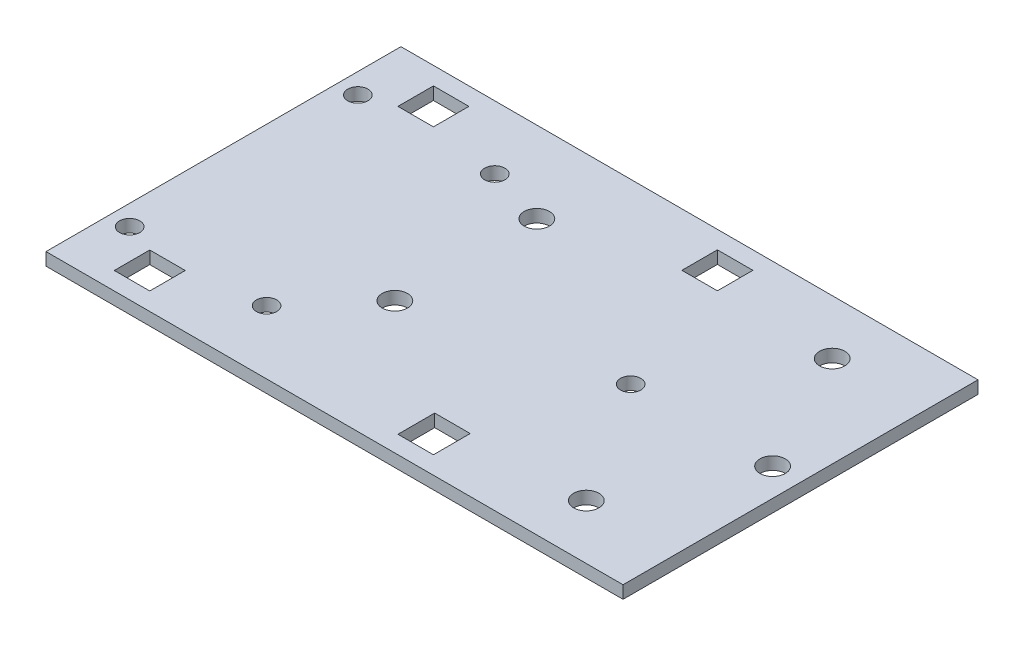
ISO-10303-21;
HEADER;
FILE_DESCRIPTION(('STEP AP214'),'2;1');
FILE_NAME('part.step','',(''),(''),'','','');
FILE_SCHEMA(('AUTOMOTIVE_DESIGN { 1 0 10303 214 1 1 1 1 }'));
ENDSEC;
DATA;
#1=APPLICATION_CONTEXT('core data for automotive mechanical design processes');
#2=APPLICATION_PROTOCOL_DEFINITION('international standard','automotive_design',2000,#1);
#3=PRODUCT_CONTEXT('',#1,'mechanical');
#4=PRODUCT('Part','Part','',(#3));
#5=PRODUCT_RELATED_PRODUCT_CATEGORY('part','',(#4));
#6=PRODUCT_DEFINITION_FORMATION('','',#4);
#7=PRODUCT_DEFINITION_CONTEXT('part definition',#1,'design');
#8=PRODUCT_DEFINITION('design','',#6,#7);
#9=PRODUCT_DEFINITION_SHAPE('','',#8);
#10=(LENGTH_UNIT() NAMED_UNIT(*) SI_UNIT(.MILLI.,.METRE.));
#11=(NAMED_UNIT(*) PLANE_ANGLE_UNIT() SI_UNIT($,.RADIAN.));
#12=(NAMED_UNIT(*) SI_UNIT($,.STERADIAN.) SOLID_ANGLE_UNIT());
#13=UNCERTAINTY_MEASURE_WITH_UNIT(LENGTH_MEASURE(1.E-05),#10,'distance_accuracy_value','');
#14=(GEOMETRIC_REPRESENTATION_CONTEXT(3) GLOBAL_UNCERTAINTY_ASSIGNED_CONTEXT((#13)) GLOBAL_UNIT_ASSIGNED_CONTEXT((#10,
#11,#12)) REPRESENTATION_CONTEXT('',''));
#15=CARTESIAN_POINT('',(0.,0.,0.));
#16=DIRECTION('',(0.,0.,1.));
#17=DIRECTION('',(1.,0.,0.));
#18=AXIS2_PLACEMENT_3D('',#15,#16,#17);
#19=CARTESIAN_POINT('',(0.,2.5,37.3463768115942));
#20=DIRECTION('',(0.,0.,1.));
#21=DIRECTION('',(1.,0.,0.));
#22=AXIS2_PLACEMENT_3D('',#19,#20,#21);
#23=PLANE('',#22);
#24=DIRECTION('',(-1.,0.,0.));
#25=VECTOR('',#24,1.);
#26=CARTESIAN_POINT('',(0.,0.,37.3463768115942));
#27=LINE('',#26,#25);
#28=CARTESIAN_POINT('',(-7.47764977974702,0.,37.3463768115942));
#29=VERTEX_POINT('',#28);
#30=CARTESIAN_POINT('',(-14.477649779747,0.,37.3463768115942));
#31=VERTEX_POINT('',#30);
#32=EDGE_CURVE('E281',#29,#31,#27,.T.);
#33=ORIENTED_EDGE('',*,*,#32,.T.);
#34=DIRECTION('',(0.,-1.,0.));
#35=VECTOR('',#34,1.);
#36=CARTESIAN_POINT('',(-14.477649779747,2.5,37.3463768115942));
#37=LINE('',#36,#35);
#38=CARTESIAN_POINT('',(-14.477649779747,2.5,37.3463768115942));
#39=VERTEX_POINT('',#38);
#40=EDGE_CURVE('E11',#39,#31,#37,.T.);
#41=ORIENTED_EDGE('',*,*,#40,.F.);
#42=DIRECTION('',(-1.,0.,0.));
#43=VECTOR('',#42,1.);
#44=CARTESIAN_POINT('',(0.,2.5,37.3463768115942));
#45=LINE('',#44,#43);
#46=CARTESIAN_POINT('',(-7.47764977974702,2.5,37.3463768115942));
#47=VERTEX_POINT('',#46);
#48=EDGE_CURVE('E187',#47,#39,#45,.T.);
#49=ORIENTED_EDGE('',*,*,#48,.F.);
#50=DIRECTION('',(0.,-1.,0.));
#51=VECTOR('',#50,1.);
#52=CARTESIAN_POINT('',(-7.47764977974702,2.5,37.3463768115942));
#53=LINE('',#52,#51);
#54=EDGE_CURVE('E55',#47,#29,#53,.T.);
#55=ORIENTED_EDGE('',*,*,#54,.T.);
#56=EDGE_LOOP('',(#33,#41,#49,#55));
#57=FACE_BOUND('',#56,.T.);
#58=ADVANCED_FACE('F36',(#57),#23,.F.);
#59=CARTESIAN_POINT('',(-14.477649779747,2.5,0.));
#60=DIRECTION('',(-1.,0.,0.));
#61=DIRECTION('',(0.,0.,1.));
#62=AXIS2_PLACEMENT_3D('',#59,#60,#61);
#63=PLANE('',#62);
#64=DIRECTION('',(0.,0.,-1.));
#65=VECTOR('',#64,1.);
#66=CARTESIAN_POINT('',(-14.477649779747,0.,0.));
#67=LINE('',#66,#65);
#68=CARTESIAN_POINT('',(-14.477649779747,0.,30.0963768115942));
#69=VERTEX_POINT('',#68);
#70=EDGE_CURVE('E193',#31,#69,#67,.T.);
#71=ORIENTED_EDGE('',*,*,#70,.T.);
#72=DIRECTION('',(0.,-1.,0.));
#73=VECTOR('',#72,1.);
#74=CARTESIAN_POINT('',(-14.477649779747,2.5,30.0963768115942));
#75=LINE('',#74,#73);
#76=CARTESIAN_POINT('',(-14.477649779747,2.5,30.0963768115942));
#77=VERTEX_POINT('',#76);
#78=EDGE_CURVE('E46',#77,#69,#75,.T.);
#79=ORIENTED_EDGE('',*,*,#78,.F.);
#80=DIRECTION('',(0.,0.,-1.));
#81=VECTOR('',#80,1.);
#82=CARTESIAN_POINT('',(-14.477649779747,2.5,0.));
#83=LINE('',#82,#81);
#84=EDGE_CURVE('E181',#39,#77,#83,.T.);
#85=ORIENTED_EDGE('',*,*,#84,.F.);
#86=ORIENTED_EDGE('',*,*,#40,.T.);
#87=EDGE_LOOP('',(#71,#79,#85,#86));
#88=FACE_BOUND('',#87,.T.);
#89=ADVANCED_FACE('F192',(#88),#63,.F.);
#90=CARTESIAN_POINT('',(0.,2.5,30.0963768115942));
#91=DIRECTION('',(0.,0.,1.));
#92=DIRECTION('',(1.,0.,0.));
#93=AXIS2_PLACEMENT_3D('',#90,#91,#92);
#94=PLANE('',#93);
#95=DIRECTION('',(-1.,0.,0.));
#96=VECTOR('',#95,1.);
#97=CARTESIAN_POINT('',(0.,0.,30.0963768115942));
#98=LINE('',#97,#96);
#99=CARTESIAN_POINT('',(-7.47764977974702,0.,30.0963768115942));
#100=VERTEX_POINT('',#99);
#101=EDGE_CURVE('E284',#100,#69,#98,.T.);
#102=ORIENTED_EDGE('',*,*,#101,.F.);
#103=DIRECTION('',(0.,-1.,0.));
#104=VECTOR('',#103,1.);
#105=CARTESIAN_POINT('',(-7.47764977974702,2.5,30.0963768115942));
#106=LINE('',#105,#104);
#107=CARTESIAN_POINT('',(-7.47764977974702,2.5,30.0963768115942));
#108=VERTEX_POINT('',#107);
#109=EDGE_CURVE('E117',#108,#100,#106,.T.);
#110=ORIENTED_EDGE('',*,*,#109,.F.);
#111=DIRECTION('',(-1.,0.,0.));
#112=VECTOR('',#111,1.);
#113=CARTESIAN_POINT('',(0.,2.5,30.0963768115942));
#114=LINE('',#113,#112);
#115=EDGE_CURVE('E186',#108,#77,#114,.T.);
#116=ORIENTED_EDGE('',*,*,#115,.T.);
#117=ORIENTED_EDGE('',*,*,#78,.T.);
#118=EDGE_LOOP('',(#102,#110,#116,#117));
#119=FACE_BOUND('',#118,.T.);
#120=ADVANCED_FACE('F197',(#119),#94,.T.);
#121=CARTESIAN_POINT('',(0.,2.5,40.8463768115942));
#122=DIRECTION('',(0.,0.,-1.));
#123=DIRECTION('',(-1.,0.,0.));
#124=AXIS2_PLACEMENT_3D('',#121,#122,#123);
#125=PLANE('',#124);
#126=DIRECTION('',(1.,0.,0.));
#127=VECTOR('',#126,1.);
#128=CARTESIAN_POINT('',(0.,0.,40.8463768115942));
#129=LINE('',#128,#127);
#130=CARTESIAN_POINT('',(-80.3826086956522,0.,40.8463768115942));
#131=VERTEX_POINT('',#130);
#132=CARTESIAN_POINT('',(33.4173913043478,0.,40.8463768115942));
#133=VERTEX_POINT('',#132);
#134=EDGE_CURVE('E270',#131,#133,#129,.T.);
#135=ORIENTED_EDGE('',*,*,#134,.T.);
#136=DIRECTION('',(0.,-1.,0.));
#137=VECTOR('',#136,1.);
#138=CARTESIAN_POINT('',(33.4173913043478,2.5,40.8463768115942));
#139=LINE('',#138,#137);
#140=CARTESIAN_POINT('',(33.4173913043478,2.5,40.8463768115942));
#141=VERTEX_POINT('',#140);
#142=EDGE_CURVE('E291',#141,#133,#139,.T.);
#143=ORIENTED_EDGE('',*,*,#142,.F.);
#144=DIRECTION('',(1.,0.,0.));
#145=VECTOR('',#144,1.);
#146=CARTESIAN_POINT('',(0.,2.5,40.8463768115942));
#147=LINE('',#146,#145);
#148=CARTESIAN_POINT('',(-80.3826086956522,2.5,40.8463768115942));
#149=VERTEX_POINT('',#148);
#150=EDGE_CURVE('E757',#149,#141,#147,.T.);
#151=ORIENTED_EDGE('',*,*,#150,.F.);
#152=DIRECTION('',(0.,-1.,0.));
#153=VECTOR('',#152,1.);
#154=CARTESIAN_POINT('',(-80.3826086956522,2.5,40.8463768115942));
#155=LINE('',#154,#153);
#156=EDGE_CURVE('E293',#149,#131,#155,.T.);
#157=ORIENTED_EDGE('',*,*,#156,.T.);
#158=EDGE_LOOP('',(#135,#143,#151,#157));
#159=FACE_BOUND('',#158,.T.);
#160=ADVANCED_FACE('F372',(#159),#125,.F.);
#161=CARTESIAN_POINT('',(33.4173913043478,2.5,0.));
#162=DIRECTION('',(1.,0.,0.));
#163=DIRECTION('',(0.,0.,-1.));
#164=AXIS2_PLACEMENT_3D('',#161,#162,#163);
#165=PLANE('',#164);
#166=DIRECTION('',(0.,0.,1.));
#167=VECTOR('',#166,1.);
#168=CARTESIAN_POINT('',(33.4173913043478,0.,0.));
#169=LINE('',#168,#167);
#170=CARTESIAN_POINT('',(33.4173913043478,0.,-29.1536231884058));
#171=VERTEX_POINT('',#170);
#172=EDGE_CURVE('E273',#171,#133,#169,.T.);
#173=ORIENTED_EDGE('',*,*,#172,.F.);
#174=DIRECTION('',(0.,-1.,0.));
#175=VECTOR('',#174,1.);
#176=CARTESIAN_POINT('',(33.4173913043478,2.5,-29.1536231884058));
#177=LINE('',#176,#175);
#178=CARTESIAN_POINT('',(33.4173913043478,2.5,-29.1536231884058));
#179=VERTEX_POINT('',#178);
#180=EDGE_CURVE('E299',#179,#171,#177,.T.);
#181=ORIENTED_EDGE('',*,*,#180,.F.);
#182=DIRECTION('',(0.,0.,1.));
#183=VECTOR('',#182,1.);
#184=CARTESIAN_POINT('',(33.4173913043478,2.5,0.));
#185=LINE('',#184,#183);
#186=EDGE_CURVE('E761',#179,#141,#185,.T.);
#187=ORIENTED_EDGE('',*,*,#186,.T.);
#188=ORIENTED_EDGE('',*,*,#142,.T.);
#189=EDGE_LOOP('',(#173,#181,#187,#188));
#190=FACE_BOUND('',#189,.T.);
#191=ADVANCED_FACE('F368',(#190),#165,.T.);
#192=CARTESIAN_POINT('',(0.,2.5,-29.1536231884058));
#193=DIRECTION('',(0.,0.,-1.));
#194=DIRECTION('',(-1.,0.,0.));
#195=AXIS2_PLACEMENT_3D('',#192,#193,#194);
#196=PLANE('',#195);
#197=DIRECTION('',(1.,0.,0.));
#198=VECTOR('',#197,1.);
#199=CARTESIAN_POINT('',(0.,0.,-29.1536231884058));
#200=LINE('',#199,#198);
#201=CARTESIAN_POINT('',(-80.3826086956522,0.,-29.1536231884058));
#202=VERTEX_POINT('',#201);
#203=EDGE_CURVE('E276',#202,#171,#200,.T.);
#204=ORIENTED_EDGE('',*,*,#203,.F.);
#205=DIRECTION('',(0.,-1.,0.));
#206=VECTOR('',#205,1.);
#207=CARTESIAN_POINT('',(-80.3826086956522,2.5,-29.1536231884058));
#208=LINE('',#207,#206);
#209=CARTESIAN_POINT('',(-80.3826086956522,2.5,-29.1536231884058));
#210=VERTEX_POINT('',#209);
#211=EDGE_CURVE('E296',#210,#202,#208,.T.);
#212=ORIENTED_EDGE('',*,*,#211,.F.);
#213=DIRECTION('',(1.,0.,0.));
#214=VECTOR('',#213,1.);
#215=CARTESIAN_POINT('',(0.,2.5,-29.1536231884058));
#216=LINE('',#215,#214);
#217=EDGE_CURVE('E770',#210,#179,#216,.T.);
#218=ORIENTED_EDGE('',*,*,#217,.T.);
#219=ORIENTED_EDGE('',*,*,#180,.T.);
#220=EDGE_LOOP('',(#204,#212,#218,#219));
#221=FACE_BOUND('',#220,.T.);
#222=ADVANCED_FACE('F364',(#221),#196,.T.);
#223=CARTESIAN_POINT('',(-14.477649779747,2.5,0.));
#224=DIRECTION('',(1.,0.,0.));
#225=DIRECTION('',(0.,0.,-1.));
#226=AXIS2_PLACEMENT_3D('',#223,#224,#225);
#227=PLANE('',#226);
#228=DIRECTION('',(0.,0.,1.));
#229=VECTOR('',#228,1.);
#230=CARTESIAN_POINT('',(-14.477649779747,0.,0.));
#231=LINE('',#230,#229);
#232=CARTESIAN_POINT('',(-14.477649779747,0.,-25.6536231884058));
#233=VERTEX_POINT('',#232);
#234=CARTESIAN_POINT('',(-14.477649779747,0.,-18.6536231884058));
#235=VERTEX_POINT('',#234);
#236=EDGE_CURVE('E258',#233,#235,#231,.T.);
#237=ORIENTED_EDGE('',*,*,#236,.F.);
#238=DIRECTION('',(0.,-1.,0.));
#239=VECTOR('',#238,1.);
#240=CARTESIAN_POINT('',(-14.477649779747,2.5,-25.6536231884058));
#241=LINE('',#240,#239);
#242=CARTESIAN_POINT('',(-14.477649779747,2.5,-25.6536231884058));
#243=VERTEX_POINT('',#242);
#244=EDGE_CURVE('E297',#243,#233,#241,.T.);
#245=ORIENTED_EDGE('',*,*,#244,.F.);
#246=DIRECTION('',(0.,0.,1.));
#247=VECTOR('',#246,1.);
#248=CARTESIAN_POINT('',(-14.477649779747,2.5,0.));
#249=LINE('',#248,#247);
#250=CARTESIAN_POINT('',(-14.477649779747,2.5,-18.6536231884058));
#251=VERTEX_POINT('',#250);
#252=EDGE_CURVE('E753',#243,#251,#249,.T.);
#253=ORIENTED_EDGE('',*,*,#252,.T.);
#254=DIRECTION('',(0.,-1.,0.));
#255=VECTOR('',#254,1.);
#256=CARTESIAN_POINT('',(-14.477649779747,2.5,-18.6536231884058));
#257=LINE('',#256,#255);
#258=EDGE_CURVE('E302',#251,#235,#257,.T.);
#259=ORIENTED_EDGE('',*,*,#258,.T.);
#260=EDGE_LOOP('',(#237,#245,#253,#259));
#261=FACE_BOUND('',#260,.T.);
#262=ADVANCED_FACE('F367',(#261),#227,.T.);
#263=CARTESIAN_POINT('',(0.,2.5,-25.6536231884058));
#264=DIRECTION('',(0.,0.,1.));
#265=DIRECTION('',(1.,0.,0.));
#266=AXIS2_PLACEMENT_3D('',#263,#264,#265);
#267=PLANE('',#266);
#268=DIRECTION('',(-1.,0.,0.));
#269=VECTOR('',#268,1.);
#270=CARTESIAN_POINT('',(0.,0.,-25.6536231884058));
#271=LINE('',#270,#269);
#272=CARTESIAN_POINT('',(-7.47764977974702,0.,-25.6536231884058));
#273=VERTEX_POINT('',#272);
#274=EDGE_CURVE('E261',#273,#233,#271,.T.);
#275=ORIENTED_EDGE('',*,*,#274,.F.);
#276=DIRECTION('',(0.,-1.,0.));
#277=VECTOR('',#276,1.);
#278=CARTESIAN_POINT('',(-7.47764977974702,2.5,-25.6536231884058));
#279=LINE('',#278,#277);
#280=CARTESIAN_POINT('',(-7.47764977974702,2.5,-25.6536231884058));
#281=VERTEX_POINT('',#280);
#282=EDGE_CURVE('E308',#281,#273,#279,.T.);
#283=ORIENTED_EDGE('',*,*,#282,.F.);
#284=DIRECTION('',(-1.,0.,0.));
#285=VECTOR('',#284,1.);
#286=CARTESIAN_POINT('',(0.,2.5,-25.6536231884058));
#287=LINE('',#286,#285);
#288=EDGE_CURVE('E779',#281,#243,#287,.T.);
#289=ORIENTED_EDGE('',*,*,#288,.T.);
#290=ORIENTED_EDGE('',*,*,#244,.T.);
#291=EDGE_LOOP('',(#275,#283,#289,#290));
#292=FACE_BOUND('',#291,.T.);
#293=ADVANCED_FACE('F385',(#292),#267,.T.);
#294=CARTESIAN_POINT('',(-7.47764977974704,2.5,0.));
#295=DIRECTION('',(1.,0.,0.));
#296=DIRECTION('',(0.,0.,-1.));
#297=AXIS2_PLACEMENT_3D('',#294,#295,#296);
#298=PLANE('',#297);
#299=DIRECTION('',(0.,0.,1.));
#300=VECTOR('',#299,1.);
#301=CARTESIAN_POINT('',(-7.47764977974704,0.,0.));
#302=LINE('',#301,#300);
#303=CARTESIAN_POINT('',(-7.47764977974702,0.,-18.6536231884058));
#304=VERTEX_POINT('',#303);
#305=EDGE_CURVE('E264',#273,#304,#302,.T.);
#306=ORIENTED_EDGE('',*,*,#305,.T.);
#307=DIRECTION('',(0.,-1.,0.));
#308=VECTOR('',#307,1.);
#309=CARTESIAN_POINT('',(-7.47764977974702,2.5,-18.6536231884058));
#310=LINE('',#309,#308);
#311=CARTESIAN_POINT('',(-7.47764977974702,2.5,-18.6536231884058));
#312=VERTEX_POINT('',#311);
#313=EDGE_CURVE('E304',#312,#304,#310,.T.);
#314=ORIENTED_EDGE('',*,*,#313,.F.);
#315=DIRECTION('',(0.,0.,1.));
#316=VECTOR('',#315,1.);
#317=CARTESIAN_POINT('',(-7.47764977974704,2.5,0.));
#318=LINE('',#317,#316);
#319=EDGE_CURVE('E776',#281,#312,#318,.T.);
#320=ORIENTED_EDGE('',*,*,#319,.F.);
#321=ORIENTED_EDGE('',*,*,#282,.T.);
#322=EDGE_LOOP('',(#306,#314,#320,#321));
#323=FACE_BOUND('',#322,.T.);
#324=ADVANCED_FACE('F381',(#323),#298,.F.);
#325=CARTESIAN_POINT('',(0.,2.5,37.3463768115942));
#326=DIRECTION('',(0.,0.,-1.));
#327=DIRECTION('',(-1.,0.,0.));
#328=AXIS2_PLACEMENT_3D('',#325,#326,#327);
#329=PLANE('',#328);
#330=DIRECTION('',(1.,0.,0.));
#331=VECTOR('',#330,1.);
#332=CARTESIAN_POINT('',(0.,0.,37.3463768115942));
#333=LINE('',#332,#331);
#334=CARTESIAN_POINT('',(-70.4218553798005,0.,37.3463768115942));
#335=VERTEX_POINT('',#334);
#336=CARTESIAN_POINT('',(-63.4218553798005,0.,37.3463768115942));
#337=VERTEX_POINT('',#336);
#338=EDGE_CURVE('E219',#335,#337,#333,.T.);
#339=ORIENTED_EDGE('',*,*,#338,.F.);
#340=DIRECTION('',(0.,-1.,0.));
#341=VECTOR('',#340,1.);
#342=CARTESIAN_POINT('',(-70.4218553798005,2.5,37.3463768115942));
#343=LINE('',#342,#341);
#344=CARTESIAN_POINT('',(-70.4218553798005,2.5,37.3463768115942));
#345=VERTEX_POINT('',#344);
#346=EDGE_CURVE('E305',#345,#335,#343,.T.);
#347=ORIENTED_EDGE('',*,*,#346,.F.);
#348=DIRECTION('',(1.,0.,0.));
#349=VECTOR('',#348,1.);
#350=CARTESIAN_POINT('',(0.,2.5,37.3463768115942));
#351=LINE('',#350,#349);
#352=CARTESIAN_POINT('',(-63.4218553798005,2.5,37.3463768115942));
#353=VERTEX_POINT('',#352);
#354=EDGE_CURVE('E712',#345,#353,#351,.T.);
#355=ORIENTED_EDGE('',*,*,#354,.T.);
#356=DIRECTION('',(0.,-1.,0.));
#357=VECTOR('',#356,1.);
#358=CARTESIAN_POINT('',(-63.4218553798005,2.5,37.3463768115942));
#359=LINE('',#358,#357);
#360=EDGE_CURVE('E311',#353,#337,#359,.T.);
#361=ORIENTED_EDGE('',*,*,#360,.T.);
#362=EDGE_LOOP('',(#339,#347,#355,#361));
#363=FACE_BOUND('',#362,.T.);
#364=ADVANCED_FACE('F384',(#363),#329,.T.);
#365=CARTESIAN_POINT('',(-70.4218553798005,2.5,0.));
#366=DIRECTION('',(-1.,0.,0.));
#367=DIRECTION('',(0.,0.,1.));
#368=AXIS2_PLACEMENT_3D('',#365,#366,#367);
#369=PLANE('',#368);
#370=DIRECTION('',(0.,0.,-1.));
#371=VECTOR('',#370,1.);
#372=CARTESIAN_POINT('',(-70.4218553798005,0.,0.));
#373=LINE('',#372,#371);
#374=CARTESIAN_POINT('',(-70.4218553798005,0.,30.3463768115942));
#375=VERTEX_POINT('',#374);
#376=EDGE_CURVE('E222',#335,#375,#373,.T.);
#377=ORIENTED_EDGE('',*,*,#376,.T.);
#378=DIRECTION('',(0.,-1.,0.));
#379=VECTOR('',#378,1.);
#380=CARTESIAN_POINT('',(-70.4218553798005,2.5,30.3463768115942));
#381=LINE('',#380,#379);
#382=CARTESIAN_POINT('',(-70.4218553798005,2.5,30.3463768115942));
#383=VERTEX_POINT('',#382);
#384=EDGE_CURVE('E315',#383,#375,#381,.T.);
#385=ORIENTED_EDGE('',*,*,#384,.F.);
#386=DIRECTION('',(0.,0.,-1.));
#387=VECTOR('',#386,1.);
#388=CARTESIAN_POINT('',(-70.4218553798005,2.5,0.));
#389=LINE('',#388,#387);
#390=EDGE_CURVE('E796',#345,#383,#389,.T.);
#391=ORIENTED_EDGE('',*,*,#390,.F.);
#392=ORIENTED_EDGE('',*,*,#346,.T.);
#393=EDGE_LOOP('',(#377,#385,#391,#392));
#394=FACE_BOUND('',#393,.T.);
#395=ADVANCED_FACE('F435',(#394),#369,.F.);
#396=CARTESIAN_POINT('',(0.,2.5,30.3463768115942));
#397=DIRECTION('',(0.,0.,-1.));
#398=DIRECTION('',(-1.,0.,0.));
#399=AXIS2_PLACEMENT_3D('',#396,#397,#398);
#400=PLANE('',#399);
#401=DIRECTION('',(1.,0.,0.));
#402=VECTOR('',#401,1.);
#403=CARTESIAN_POINT('',(0.,0.,30.3463768115942));
#404=LINE('',#403,#402);
#405=CARTESIAN_POINT('',(-63.4218553798005,0.,30.3463768115942));
#406=VERTEX_POINT('',#405);
#407=EDGE_CURVE('E225',#375,#406,#404,.T.);
#408=ORIENTED_EDGE('',*,*,#407,.T.);
#409=DIRECTION('',(0.,-1.,0.));
#410=VECTOR('',#409,1.);
#411=CARTESIAN_POINT('',(-63.4218553798005,2.5,30.3463768115942));
#412=LINE('',#411,#410);
#413=CARTESIAN_POINT('',(-63.4218553798005,2.5,30.3463768115942));
#414=VERTEX_POINT('',#413);
#415=EDGE_CURVE('E313',#414,#406,#412,.T.);
#416=ORIENTED_EDGE('',*,*,#415,.F.);
#417=DIRECTION('',(1.,0.,0.));
#418=VECTOR('',#417,1.);
#419=CARTESIAN_POINT('',(0.,2.5,30.3463768115942));
#420=LINE('',#419,#418);
#421=EDGE_CURVE('E794',#383,#414,#420,.T.);
#422=ORIENTED_EDGE('',*,*,#421,.F.);
#423=ORIENTED_EDGE('',*,*,#384,.T.);
#424=EDGE_LOOP('',(#408,#416,#422,#423));
#425=FACE_BOUND('',#424,.T.);
#426=ADVANCED_FACE('F432',(#425),#400,.F.);
#427=CARTESIAN_POINT('',(-70.477649779747,2.5,0.));
#428=DIRECTION('',(1.,0.,0.));
#429=DIRECTION('',(0.,0.,-1.));
#430=AXIS2_PLACEMENT_3D('',#427,#428,#429);
#431=PLANE('',#430);
#432=DIRECTION('',(0.,0.,1.));
#433=VECTOR('',#432,1.);
#434=CARTESIAN_POINT('',(-70.477649779747,0.,0.));
#435=LINE('',#434,#433);
#436=CARTESIAN_POINT('',(-70.477649779747,0.,-25.6536231884058));
#437=VERTEX_POINT('',#436);
#438=CARTESIAN_POINT('',(-70.477649779747,0.,-18.6536231884058));
#439=VERTEX_POINT('',#438);
#440=EDGE_CURVE('E207',#437,#439,#435,.T.);
#441=ORIENTED_EDGE('',*,*,#440,.F.);
#442=DIRECTION('',(0.,-1.,0.));
#443=VECTOR('',#442,1.);
#444=CARTESIAN_POINT('',(-70.477649779747,2.5,-25.6536231884058));
#445=LINE('',#444,#443);
#446=CARTESIAN_POINT('',(-70.477649779747,2.5,-25.6536231884058));
#447=VERTEX_POINT('',#446);
#448=EDGE_CURVE('E40',#447,#437,#445,.T.);
#449=ORIENTED_EDGE('',*,*,#448,.F.);
#450=DIRECTION('',(0.,0.,1.));
#451=VECTOR('',#450,1.);
#452=CARTESIAN_POINT('',(-70.477649779747,2.5,0.));
#453=LINE('',#452,#451);
#454=CARTESIAN_POINT('',(-70.477649779747,2.5,-18.6536231884058));
#455=VERTEX_POINT('',#454);
#456=EDGE_CURVE('E336',#447,#455,#453,.T.);
#457=ORIENTED_EDGE('',*,*,#456,.T.);
#458=DIRECTION('',(0.,-1.,0.));
#459=VECTOR('',#458,1.);
#460=CARTESIAN_POINT('',(-70.477649779747,2.5,-18.6536231884058));
#461=LINE('',#460,#459);
#462=EDGE_CURVE('E200',#455,#439,#461,.T.);
#463=ORIENTED_EDGE('',*,*,#462,.T.);
#464=EDGE_LOOP('',(#441,#449,#457,#463));
#465=FACE_BOUND('',#464,.T.);
#466=ADVANCED_FACE('F335',(#465),#431,.T.);
#467=CARTESIAN_POINT('',(0.,2.5,-25.6536231884058));
#468=DIRECTION('',(0.,0.,-1.));
#469=DIRECTION('',(-1.,0.,0.));
#470=AXIS2_PLACEMENT_3D('',#467,#468,#469);
#471=PLANE('',#470);
#472=DIRECTION('',(1.,0.,0.));
#473=VECTOR('',#472,1.);
#474=CARTESIAN_POINT('',(0.,0.,-25.6536231884058));
#475=LINE('',#474,#473);
#476=CARTESIAN_POINT('',(-63.477649779747,0.,-25.6536231884058));
#477=VERTEX_POINT('',#476);
#478=EDGE_CURVE('E210',#437,#477,#475,.T.);
#479=ORIENTED_EDGE('',*,*,#478,.T.);
#480=DIRECTION('',(0.,-1.,0.));
#481=VECTOR('',#480,1.);
#482=CARTESIAN_POINT('',(-63.477649779747,2.5,-25.6536231884058));
#483=LINE('',#482,#481);
#484=CARTESIAN_POINT('',(-63.477649779747,2.5,-25.6536231884058));
#485=VERTEX_POINT('',#484);
#486=EDGE_CURVE('E321',#485,#477,#483,.T.);
#487=ORIENTED_EDGE('',*,*,#486,.F.);
#488=DIRECTION('',(1.,0.,0.));
#489=VECTOR('',#488,1.);
#490=CARTESIAN_POINT('',(0.,2.5,-25.6536231884058));
#491=LINE('',#490,#489);
#492=EDGE_CURVE('E329',#447,#485,#491,.T.);
#493=ORIENTED_EDGE('',*,*,#492,.F.);
#494=ORIENTED_EDGE('',*,*,#448,.T.);
#495=EDGE_LOOP('',(#479,#487,#493,#494));
#496=FACE_BOUND('',#495,.T.);
#497=ADVANCED_FACE('F327',(#496),#471,.F.);
#498=CARTESIAN_POINT('',(-63.477649779747,2.5,0.));
#499=DIRECTION('',(1.,0.,0.));
#500=DIRECTION('',(0.,0.,-1.));
#501=AXIS2_PLACEMENT_3D('',#498,#499,#500);
#502=PLANE('',#501);
#503=DIRECTION('',(0.,0.,1.));
#504=VECTOR('',#503,1.);
#505=CARTESIAN_POINT('',(-63.477649779747,0.,0.));
#506=LINE('',#505,#504);
#507=CARTESIAN_POINT('',(-63.477649779747,0.,-18.6536231884058));
#508=VERTEX_POINT('',#507);
#509=EDGE_CURVE('E213',#477,#508,#506,.T.);
#510=ORIENTED_EDGE('',*,*,#509,.T.);
#511=DIRECTION('',(0.,-1.,0.));
#512=VECTOR('',#511,1.);
#513=CARTESIAN_POINT('',(-63.477649779747,2.5,-18.6536231884058));
#514=LINE('',#513,#512);
#515=CARTESIAN_POINT('',(-63.477649779747,2.5,-18.6536231884058));
#516=VERTEX_POINT('',#515);
#517=EDGE_CURVE('E320',#516,#508,#514,.T.);
#518=ORIENTED_EDGE('',*,*,#517,.F.);
#519=DIRECTION('',(0.,0.,1.));
#520=VECTOR('',#519,1.);
#521=CARTESIAN_POINT('',(-63.477649779747,2.5,0.));
#522=LINE('',#521,#520);
#523=EDGE_CURVE('E800',#485,#516,#522,.T.);
#524=ORIENTED_EDGE('',*,*,#523,.F.);
#525=ORIENTED_EDGE('',*,*,#486,.T.);
#526=EDGE_LOOP('',(#510,#518,#524,#525));
#527=FACE_BOUND('',#526,.T.);
#528=ADVANCED_FACE('F343',(#527),#502,.F.);
#529=CARTESIAN_POINT('',(-80.3826086956522,2.5,0.));
#530=DIRECTION('',(1.,0.,0.));
#531=DIRECTION('',(0.,0.,-1.));
#532=AXIS2_PLACEMENT_3D('',#529,#530,#531);
#533=PLANE('',#532);
#534=DIRECTION('',(0.,0.,1.));
#535=VECTOR('',#534,1.);
#536=CARTESIAN_POINT('',(-80.3826086956522,0.,0.));
#537=LINE('',#536,#535);
#538=EDGE_CURVE('E279',#202,#131,#537,.T.);
#539=ORIENTED_EDGE('',*,*,#538,.T.);
#540=ORIENTED_EDGE('',*,*,#156,.F.);
#541=DIRECTION('',(0.,0.,1.));
#542=VECTOR('',#541,1.);
#543=CARTESIAN_POINT('',(-80.3826086956522,2.5,0.));
#544=LINE('',#543,#542);
#545=EDGE_CURVE('E764',#210,#149,#544,.T.);
#546=ORIENTED_EDGE('',*,*,#545,.F.);
#547=ORIENTED_EDGE('',*,*,#211,.T.);
#548=EDGE_LOOP('',(#539,#540,#546,#547));
#549=FACE_BOUND('',#548,.T.);
#550=ADVANCED_FACE('F345',(#549),#533,.F.);
#551=CARTESIAN_POINT('',(0.,2.5,-18.6536231884058));
#552=DIRECTION('',(0.,0.,1.));
#553=DIRECTION('',(1.,0.,0.));
#554=AXIS2_PLACEMENT_3D('',#551,#552,#553);
#555=PLANE('',#554);
#556=DIRECTION('',(-1.,0.,0.));
#557=VECTOR('',#556,1.);
#558=CARTESIAN_POINT('',(0.,0.,-18.6536231884058));
#559=LINE('',#558,#557);
#560=EDGE_CURVE('E267',#304,#235,#559,.T.);
#561=ORIENTED_EDGE('',*,*,#560,.T.);
#562=ORIENTED_EDGE('',*,*,#258,.F.);
#563=DIRECTION('',(-1.,0.,0.));
#564=VECTOR('',#563,1.);
#565=CARTESIAN_POINT('',(0.,2.5,-18.6536231884058));
#566=LINE('',#565,#564);
#567=EDGE_CURVE('E766',#312,#251,#566,.T.);
#568=ORIENTED_EDGE('',*,*,#567,.F.);
#569=ORIENTED_EDGE('',*,*,#313,.T.);
#570=EDGE_LOOP('',(#561,#562,#568,#569));
#571=FACE_BOUND('',#570,.T.);
#572=ADVANCED_FACE('F351',(#571),#555,.F.);
#573=CARTESIAN_POINT('',(15.4173913043478,2.5,-18.4036231884058));
#574=DIRECTION('',(0.,-1.,0.));
#575=DIRECTION('',(0.,0.,-1.));
#576=AXIS2_PLACEMENT_3D('',#573,#574,#575);
#577=CYLINDRICAL_SURFACE('',#576,2.5);
#578=CARTESIAN_POINT('',(15.4173913043478,2.5,-18.4036231884058));
#579=DIRECTION('',(0.,1.,0.));
#580=DIRECTION('',(0.,0.,1.));
#581=AXIS2_PLACEMENT_3D('',#578,#579,#580);
#582=CIRCLE('',#581,2.5);
#583=CARTESIAN_POINT('',(15.4173913043478,2.5,-15.9036231884058));
#584=VERTEX_POINT('',#583);
#585=EDGE_CURVE('E748',#584,#584,#582,.T.);
#586=ORIENTED_EDGE('',*,*,#585,.T.);
#587=EDGE_LOOP('',(#586));
#588=FACE_BOUND('',#587,.T.);
#589=CARTESIAN_POINT('',(15.4173913043478,0.,-18.4036231884058));
#590=DIRECTION('',(0.,1.,0.));
#591=DIRECTION('',(0.,0.,1.));
#592=AXIS2_PLACEMENT_3D('',#589,#590,#591);
#593=CIRCLE('',#592,2.5);
#594=CARTESIAN_POINT('',(15.4173913043478,0.,-15.9036231884058));
#595=VERTEX_POINT('',#594);
#596=EDGE_CURVE('E255',#595,#595,#593,.T.);
#597=ORIENTED_EDGE('',*,*,#596,.F.);
#598=EDGE_LOOP('',(#597));
#599=FACE_BOUND('',#598,.T.);
#600=ADVANCED_FACE('F379',(#588,#599),#577,.F.);
#601=CARTESIAN_POINT('',(15.4173913043478,2.5,30.0963768115942));
#602=DIRECTION('',(0.,-1.,0.));
#603=DIRECTION('',(0.,0.,-1.));
#604=AXIS2_PLACEMENT_3D('',#601,#602,#603);
#605=CYLINDRICAL_SURFACE('',#604,2.5);
#606=CARTESIAN_POINT('',(15.4173913043478,2.5,30.0963768115942));
#607=DIRECTION('',(0.,1.,0.));
#608=DIRECTION('',(0.,0.,1.));
#609=AXIS2_PLACEMENT_3D('',#606,#607,#608);
#610=CIRCLE('',#609,2.5);
#611=CARTESIAN_POINT('',(15.4173913043478,2.5,32.5963768115942));
#612=VERTEX_POINT('',#611);
#613=EDGE_CURVE('E744',#612,#612,#610,.T.);
#614=ORIENTED_EDGE('',*,*,#613,.T.);
#615=EDGE_LOOP('',(#614));
#616=FACE_BOUND('',#615,.T.);
#617=CARTESIAN_POINT('',(15.4173913043478,0.,30.0963768115942));
#618=DIRECTION('',(0.,1.,0.));
#619=DIRECTION('',(0.,0.,1.));
#620=AXIS2_PLACEMENT_3D('',#617,#618,#619);
#621=CIRCLE('',#620,2.5);
#622=CARTESIAN_POINT('',(15.4173913043478,0.,32.5963768115942));
#623=VERTEX_POINT('',#622);
#624=EDGE_CURVE('E252',#623,#623,#621,.T.);
#625=ORIENTED_EDGE('',*,*,#624,.F.);
#626=EDGE_LOOP('',(#625));
#627=FACE_BOUND('',#626,.T.);
#628=ADVANCED_FACE('F395',(#616,#627),#605,.F.);
#629=CARTESIAN_POINT('',(-37.5826086956522,2.5,-13.1536231884058));
#630=DIRECTION('',(0.,-1.,0.));
#631=DIRECTION('',(0.,0.,-1.));
#632=AXIS2_PLACEMENT_3D('',#629,#630,#631);
#633=CYLINDRICAL_SURFACE('',#632,2.5);
#634=CARTESIAN_POINT('',(-37.5826086956522,2.5,-13.1536231884058));
#635=DIRECTION('',(0.,1.,0.));
#636=DIRECTION('',(0.,0.,1.));
#637=AXIS2_PLACEMENT_3D('',#634,#635,#636);
#638=CIRCLE('',#637,2.5);
#639=CARTESIAN_POINT('',(-37.5826086956522,2.5,-10.6536231884058));
#640=VERTEX_POINT('',#639);
#641=EDGE_CURVE('E740',#640,#640,#638,.T.);
#642=ORIENTED_EDGE('',*,*,#641,.T.);
#643=EDGE_LOOP('',(#642));
#644=FACE_BOUND('',#643,.T.);
#645=CARTESIAN_POINT('',(-37.5826086956522,0.,-13.1536231884058));
#646=DIRECTION('',(0.,1.,0.));
#647=DIRECTION('',(0.,0.,1.));
#648=AXIS2_PLACEMENT_3D('',#645,#646,#647);
#649=CIRCLE('',#648,2.5);
#650=CARTESIAN_POINT('',(-37.5826086956522,0.,-10.6536231884058));
#651=VERTEX_POINT('',#650);
#652=EDGE_CURVE('E249',#651,#651,#649,.T.);
#653=ORIENTED_EDGE('',*,*,#652,.F.);
#654=EDGE_LOOP('',(#653));
#655=FACE_BOUND('',#654,.T.);
#656=ADVANCED_FACE('F399',(#644,#655),#633,.F.);
#657=CARTESIAN_POINT('',(-37.5826086956522,2.5,14.8463768115942));
#658=DIRECTION('',(0.,-1.,0.));
#659=DIRECTION('',(0.,0.,-1.));
#660=AXIS2_PLACEMENT_3D('',#657,#658,#659);
#661=CYLINDRICAL_SURFACE('',#660,2.5);
#662=CARTESIAN_POINT('',(-37.5826086956522,2.5,14.8463768115942));
#663=DIRECTION('',(0.,1.,0.));
#664=DIRECTION('',(0.,0.,1.));
#665=AXIS2_PLACEMENT_3D('',#662,#663,#664);
#666=CIRCLE('',#665,2.5);
#667=CARTESIAN_POINT('',(-37.5826086956522,2.5,17.3463768115942));
#668=VERTEX_POINT('',#667);
#669=EDGE_CURVE('E736',#668,#668,#666,.T.);
#670=ORIENTED_EDGE('',*,*,#669,.T.);
#671=EDGE_LOOP('',(#670));
#672=FACE_BOUND('',#671,.T.);
#673=CARTESIAN_POINT('',(-37.5826086956522,0.,14.8463768115942));
#674=DIRECTION('',(0.,1.,0.));
#675=DIRECTION('',(0.,0.,1.));
#676=AXIS2_PLACEMENT_3D('',#673,#674,#675);
#677=CIRCLE('',#676,2.5);
#678=CARTESIAN_POINT('',(-37.5826086956522,0.,17.3463768115942));
#679=VERTEX_POINT('',#678);
#680=EDGE_CURVE('E246',#679,#679,#677,.T.);
#681=ORIENTED_EDGE('',*,*,#680,.F.);
#682=EDGE_LOOP('',(#681));
#683=FACE_BOUND('',#682,.T.);
#684=ADVANCED_FACE('F403',(#672,#683),#661,.F.);
#685=CARTESIAN_POINT('',(-76.3826086956522,2.5,-16.6536231884058));
#686=DIRECTION('',(0.,-1.,0.));
#687=DIRECTION('',(0.,0.,-1.));
#688=AXIS2_PLACEMENT_3D('',#685,#686,#687);
#689=CYLINDRICAL_SURFACE('',#688,2.);
#690=CARTESIAN_POINT('',(-76.3826086956522,2.5,-16.6536231884058));
#691=DIRECTION('',(0.,1.,0.));
#692=DIRECTION('',(0.,0.,1.));
#693=AXIS2_PLACEMENT_3D('',#690,#691,#692);
#694=CIRCLE('',#693,2.);
#695=CARTESIAN_POINT('',(-76.3826086956522,2.5,-14.6536231884058));
#696=VERTEX_POINT('',#695);
#697=EDGE_CURVE('E732',#696,#696,#694,.T.);
#698=ORIENTED_EDGE('',*,*,#697,.T.);
#699=EDGE_LOOP('',(#698));
#700=FACE_BOUND('',#699,.T.);
#701=CARTESIAN_POINT('',(-76.3826086956522,0.,-16.6536231884058));
#702=DIRECTION('',(0.,1.,0.));
#703=DIRECTION('',(0.,0.,1.));
#704=AXIS2_PLACEMENT_3D('',#701,#702,#703);
#705=CIRCLE('',#704,2.);
#706=CARTESIAN_POINT('',(-76.3826086956522,0.,-14.6536231884058));
#707=VERTEX_POINT('',#706);
#708=EDGE_CURVE('E243',#707,#707,#705,.T.);
#709=ORIENTED_EDGE('',*,*,#708,.F.);
#710=EDGE_LOOP('',(#709));
#711=FACE_BOUND('',#710,.T.);
#712=ADVANCED_FACE('F407',(#700,#711),#689,.F.);
#713=CARTESIAN_POINT('',(-76.3826086956522,2.5,28.3463768115942));
#714=DIRECTION('',(0.,-1.,0.));
#715=DIRECTION('',(0.,0.,-1.));
#716=AXIS2_PLACEMENT_3D('',#713,#714,#715);
#717=CYLINDRICAL_SURFACE('',#716,2.);
#718=CARTESIAN_POINT('',(-76.3826086956522,2.5,28.3463768115942));
#719=DIRECTION('',(0.,1.,0.));
#720=DIRECTION('',(0.,0.,1.));
#721=AXIS2_PLACEMENT_3D('',#718,#719,#720);
#722=CIRCLE('',#721,2.);
#723=CARTESIAN_POINT('',(-76.3826086956522,2.5,30.3463768115942));
#724=VERTEX_POINT('',#723);
#725=EDGE_CURVE('E728',#724,#724,#722,.T.);
#726=ORIENTED_EDGE('',*,*,#725,.T.);
#727=EDGE_LOOP('',(#726));
#728=FACE_BOUND('',#727,.T.);
#729=CARTESIAN_POINT('',(-76.3826086956522,0.,28.3463768115942));
#730=DIRECTION('',(0.,1.,0.));
#731=DIRECTION('',(0.,0.,1.));
#732=AXIS2_PLACEMENT_3D('',#729,#730,#731);
#733=CIRCLE('',#732,2.);
#734=CARTESIAN_POINT('',(-76.3826086956522,0.,30.3463768115942));
#735=VERTEX_POINT('',#734);
#736=EDGE_CURVE('E240',#735,#735,#733,.T.);
#737=ORIENTED_EDGE('',*,*,#736,.F.);
#738=EDGE_LOOP('',(#737));
#739=FACE_BOUND('',#738,.T.);
#740=ADVANCED_FACE('F411',(#728,#739),#717,.F.);
#741=CARTESIAN_POINT('',(-49.3826086956522,2.5,28.3463768115942));
#742=DIRECTION('',(0.,-1.,0.));
#743=DIRECTION('',(0.,0.,-1.));
#744=AXIS2_PLACEMENT_3D('',#741,#742,#743);
#745=CYLINDRICAL_SURFACE('',#744,2.);
#746=CARTESIAN_POINT('',(-49.3826086956522,2.5,28.3463768115942));
#747=DIRECTION('',(0.,1.,0.));
#748=DIRECTION('',(0.,0.,1.));
#749=AXIS2_PLACEMENT_3D('',#746,#747,#748);
#750=CIRCLE('',#749,2.);
#751=CARTESIAN_POINT('',(-49.3826086956522,2.5,30.3463768115942));
#752=VERTEX_POINT('',#751);
#753=EDGE_CURVE('E724',#752,#752,#750,.T.);
#754=ORIENTED_EDGE('',*,*,#753,.T.);
#755=EDGE_LOOP('',(#754));
#756=FACE_BOUND('',#755,.T.);
#757=CARTESIAN_POINT('',(-49.3826086956522,0.,28.3463768115942));
#758=DIRECTION('',(0.,1.,0.));
#759=DIRECTION('',(0.,0.,1.));
#760=AXIS2_PLACEMENT_3D('',#757,#758,#759);
#761=CIRCLE('',#760,2.);
#762=CARTESIAN_POINT('',(-49.3826086956522,0.,30.3463768115942));
#763=VERTEX_POINT('',#762);
#764=EDGE_CURVE('E237',#763,#763,#761,.T.);
#765=ORIENTED_EDGE('',*,*,#764,.F.);
#766=EDGE_LOOP('',(#765));
#767=FACE_BOUND('',#766,.T.);
#768=ADVANCED_FACE('F415',(#756,#767),#745,.F.);
#769=CARTESIAN_POINT('',(-49.3826086956522,2.5,-16.6536231884058));
#770=DIRECTION('',(0.,-1.,0.));
#771=DIRECTION('',(0.,0.,-1.));
#772=AXIS2_PLACEMENT_3D('',#769,#770,#771);
#773=CYLINDRICAL_SURFACE('',#772,2.);
#774=CARTESIAN_POINT('',(-49.3826086956522,2.5,-16.6536231884058));
#775=DIRECTION('',(0.,1.,0.));
#776=DIRECTION('',(0.,0.,1.));
#777=AXIS2_PLACEMENT_3D('',#774,#775,#776);
#778=CIRCLE('',#777,2.);
#779=CARTESIAN_POINT('',(-49.3826086956522,2.5,-14.6536231884058));
#780=VERTEX_POINT('',#779);
#781=EDGE_CURVE('E720',#780,#780,#778,.T.);
#782=ORIENTED_EDGE('',*,*,#781,.T.);
#783=EDGE_LOOP('',(#782));
#784=FACE_BOUND('',#783,.T.);
#785=CARTESIAN_POINT('',(-49.3826086956522,0.,-16.6536231884058));
#786=DIRECTION('',(0.,1.,0.));
#787=DIRECTION('',(0.,0.,1.));
#788=AXIS2_PLACEMENT_3D('',#785,#786,#787);
#789=CIRCLE('',#788,2.);
#790=CARTESIAN_POINT('',(-49.3826086956522,0.,-14.6536231884058));
#791=VERTEX_POINT('',#790);
#792=EDGE_CURVE('E234',#791,#791,#789,.T.);
#793=ORIENTED_EDGE('',*,*,#792,.F.);
#794=EDGE_LOOP('',(#793));
#795=FACE_BOUND('',#794,.T.);
#796=ADVANCED_FACE('F419',(#784,#795),#773,.F.);
#797=CARTESIAN_POINT('',(-0.0826086956522117,2.5,5.84637681159421));
#798=DIRECTION('',(0.,-1.,0.));
#799=DIRECTION('',(0.,0.,-1.));
#800=AXIS2_PLACEMENT_3D('',#797,#798,#799);
#801=CYLINDRICAL_SURFACE('',#800,2.);
#802=CARTESIAN_POINT('',(-0.0826086956522117,2.5,5.84637681159421));
#803=DIRECTION('',(0.,1.,0.));
#804=DIRECTION('',(0.,0.,1.));
#805=AXIS2_PLACEMENT_3D('',#802,#803,#804);
#806=CIRCLE('',#805,2.);
#807=CARTESIAN_POINT('',(-0.0826086956522117,2.5,7.84637681159421));
#808=VERTEX_POINT('',#807);
#809=EDGE_CURVE('E716',#808,#808,#806,.T.);
#810=ORIENTED_EDGE('',*,*,#809,.T.);
#811=EDGE_LOOP('',(#810));
#812=FACE_BOUND('',#811,.T.);
#813=CARTESIAN_POINT('',(-0.0826086956522117,0.,5.84637681159421));
#814=DIRECTION('',(0.,1.,0.));
#815=DIRECTION('',(0.,0.,1.));
#816=AXIS2_PLACEMENT_3D('',#813,#814,#815);
#817=CIRCLE('',#816,2.);
#818=CARTESIAN_POINT('',(-0.0826086956522117,0.,7.84637681159421));
#819=VERTEX_POINT('',#818);
#820=EDGE_CURVE('E231',#819,#819,#817,.T.);
#821=ORIENTED_EDGE('',*,*,#820,.F.);
#822=EDGE_LOOP('',(#821));
#823=FACE_BOUND('',#822,.T.);
#824=ADVANCED_FACE('F423',(#812,#823),#801,.F.);
#825=CARTESIAN_POINT('',(-63.4218553798005,2.5,0.));
#826=DIRECTION('',(-1.,0.,0.));
#827=DIRECTION('',(0.,0.,1.));
#828=AXIS2_PLACEMENT_3D('',#825,#826,#827);
#829=PLANE('',#828);
#830=DIRECTION('',(0.,0.,-1.));
#831=VECTOR('',#830,1.);
#832=CARTESIAN_POINT('',(-63.4218553798005,0.,0.));
#833=LINE('',#832,#831);
#834=EDGE_CURVE('E228',#337,#406,#833,.T.);
#835=ORIENTED_EDGE('',*,*,#834,.F.);
#836=ORIENTED_EDGE('',*,*,#360,.F.);
#837=DIRECTION('',(0.,0.,-1.));
#838=VECTOR('',#837,1.);
#839=CARTESIAN_POINT('',(-63.4218553798005,2.5,0.));
#840=LINE('',#839,#838);
#841=EDGE_CURVE('E791',#353,#414,#840,.T.);
#842=ORIENTED_EDGE('',*,*,#841,.T.);
#843=ORIENTED_EDGE('',*,*,#415,.T.);
#844=EDGE_LOOP('',(#835,#836,#842,#843));
#845=FACE_BOUND('',#844,.T.);
#846=ADVANCED_FACE('F427',(#845),#829,.T.);
#847=CARTESIAN_POINT('',(0.,2.5,-18.6536231884058));
#848=DIRECTION('',(0.,0.,-1.));
#849=DIRECTION('',(-1.,0.,0.));
#850=AXIS2_PLACEMENT_3D('',#847,#848,#849);
#851=PLANE('',#850);
#852=DIRECTION('',(1.,0.,0.));
#853=VECTOR('',#852,1.);
#854=CARTESIAN_POINT('',(0.,0.,-18.6536231884058));
#855=LINE('',#854,#853);
#856=EDGE_CURVE('E216',#439,#508,#855,.T.);
#857=ORIENTED_EDGE('',*,*,#856,.F.);
#858=ORIENTED_EDGE('',*,*,#462,.F.);
#859=DIRECTION('',(1.,0.,0.));
#860=VECTOR('',#859,1.);
#861=CARTESIAN_POINT('',(0.,2.5,-18.6536231884058));
#862=LINE('',#861,#860);
#863=EDGE_CURVE('E341',#455,#516,#862,.T.);
#864=ORIENTED_EDGE('',*,*,#863,.T.);
#865=ORIENTED_EDGE('',*,*,#517,.T.);
#866=EDGE_LOOP('',(#857,#858,#864,#865));
#867=FACE_BOUND('',#866,.T.);
#868=ADVANCED_FACE('F340',(#867),#851,.T.);
#869=CARTESIAN_POINT('',(27.9173913043478,2.5,5.84637681159421));
#870=DIRECTION('',(0.,-1.,0.));
#871=DIRECTION('',(0.,0.,-1.));
#872=AXIS2_PLACEMENT_3D('',#869,#870,#871);
#873=CYLINDRICAL_SURFACE('',#872,2.50238935853024);
#874=CARTESIAN_POINT('',(27.9173913043478,2.5,5.84637681159421));
#875=DIRECTION('',(0.,1.,0.));
#876=DIRECTION('',(0.,0.,1.));
#877=AXIS2_PLACEMENT_3D('',#874,#875,#876);
#878=CIRCLE('',#877,2.50238935853024);
#879=CARTESIAN_POINT('',(27.9173913043478,2.5,8.34876617012445));
#880=VERTEX_POINT('',#879);
#881=EDGE_CURVE('E289',#880,#880,#878,.T.);
#882=ORIENTED_EDGE('',*,*,#881,.T.);
#883=EDGE_LOOP('',(#882));
#884=FACE_BOUND('',#883,.T.);
#885=CARTESIAN_POINT('',(27.9173913043478,0.,5.84637681159421));
#886=DIRECTION('',(0.,1.,0.));
#887=DIRECTION('',(0.,0.,1.));
#888=AXIS2_PLACEMENT_3D('',#885,#886,#887);
#889=CIRCLE('',#888,2.50238935853024);
#890=CARTESIAN_POINT('',(27.9173913043478,0.,8.34876617012445));
#891=VERTEX_POINT('',#890);
#892=EDGE_CURVE('E204',#891,#891,#889,.T.);
#893=ORIENTED_EDGE('',*,*,#892,.F.);
#894=EDGE_LOOP('',(#893));
#895=FACE_BOUND('',#894,.T.);
#896=ADVANCED_FACE('F38',(#884,#895),#873,.F.);
#897=CARTESIAN_POINT('',(-7.47764977974702,2.5,0.));
#898=DIRECTION('',(-1.,0.,0.));
#899=DIRECTION('',(0.,0.,1.));
#900=AXIS2_PLACEMENT_3D('',#897,#898,#899);
#901=PLANE('',#900);
#902=DIRECTION('',(0.,0.,-1.));
#903=VECTOR('',#902,1.);
#904=CARTESIAN_POINT('',(-7.47764977974702,0.,0.));
#905=LINE('',#904,#903);
#906=EDGE_CURVE('E286',#29,#100,#905,.T.);
#907=ORIENTED_EDGE('',*,*,#906,.F.);
#908=ORIENTED_EDGE('',*,*,#54,.F.);
#909=DIRECTION('',(0.,0.,-1.));
#910=VECTOR('',#909,1.);
#911=CARTESIAN_POINT('',(-7.47764977974702,2.5,0.));
#912=LINE('',#911,#910);
#913=EDGE_CURVE('E198',#47,#108,#912,.T.);
#914=ORIENTED_EDGE('',*,*,#913,.T.);
#915=ORIENTED_EDGE('',*,*,#109,.T.);
#916=EDGE_LOOP('',(#907,#908,#914,#915));
#917=FACE_BOUND('',#916,.T.);
#918=ADVANCED_FACE('F446',(#917),#901,.T.);
#919=CARTESIAN_POINT('',(0.,2.5,0.));
#920=DIRECTION('',(0.,1.,0.));
#921=DIRECTION('',(0.,0.,1.));
#922=AXIS2_PLACEMENT_3D('',#919,#920,#921);
#923=PLANE('',#922);
#924=ORIENTED_EDGE('',*,*,#881,.F.);
#925=EDGE_LOOP('',(#924));
#926=FACE_BOUND('',#925,.T.);
#927=ORIENTED_EDGE('',*,*,#456,.F.);
#928=ORIENTED_EDGE('',*,*,#492,.T.);
#929=ORIENTED_EDGE('',*,*,#523,.T.);
#930=ORIENTED_EDGE('',*,*,#863,.F.);
#931=EDGE_LOOP('',(#927,#928,#929,#930));
#932=FACE_BOUND('',#931,.T.);
#933=ORIENTED_EDGE('',*,*,#354,.F.);
#934=ORIENTED_EDGE('',*,*,#390,.T.);
#935=ORIENTED_EDGE('',*,*,#421,.T.);
#936=ORIENTED_EDGE('',*,*,#841,.F.);
#937=EDGE_LOOP('',(#933,#934,#935,#936));
#938=FACE_BOUND('',#937,.T.);
#939=ORIENTED_EDGE('',*,*,#809,.F.);
#940=EDGE_LOOP('',(#939));
#941=FACE_BOUND('',#940,.T.);
#942=ORIENTED_EDGE('',*,*,#781,.F.);
#943=EDGE_LOOP('',(#942));
#944=FACE_BOUND('',#943,.T.);
#945=ORIENTED_EDGE('',*,*,#753,.F.);
#946=EDGE_LOOP('',(#945));
#947=FACE_BOUND('',#946,.T.);
#948=ORIENTED_EDGE('',*,*,#725,.F.);
#949=EDGE_LOOP('',(#948));
#950=FACE_BOUND('',#949,.T.);
#951=ORIENTED_EDGE('',*,*,#697,.F.);
#952=EDGE_LOOP('',(#951));
#953=FACE_BOUND('',#952,.T.);
#954=ORIENTED_EDGE('',*,*,#669,.F.);
#955=EDGE_LOOP('',(#954));
#956=FACE_BOUND('',#955,.T.);
#957=ORIENTED_EDGE('',*,*,#641,.F.);
#958=EDGE_LOOP('',(#957));
#959=FACE_BOUND('',#958,.T.);
#960=ORIENTED_EDGE('',*,*,#613,.F.);
#961=EDGE_LOOP('',(#960));
#962=FACE_BOUND('',#961,.T.);
#963=ORIENTED_EDGE('',*,*,#585,.F.);
#964=EDGE_LOOP('',(#963));
#965=FACE_BOUND('',#964,.T.);
#966=ORIENTED_EDGE('',*,*,#252,.F.);
#967=ORIENTED_EDGE('',*,*,#288,.F.);
#968=ORIENTED_EDGE('',*,*,#319,.T.);
#969=ORIENTED_EDGE('',*,*,#567,.T.);
#970=EDGE_LOOP('',(#966,#967,#968,#969));
#971=FACE_BOUND('',#970,.T.);
#972=ORIENTED_EDGE('',*,*,#150,.T.);
#973=ORIENTED_EDGE('',*,*,#186,.F.);
#974=ORIENTED_EDGE('',*,*,#217,.F.);
#975=ORIENTED_EDGE('',*,*,#545,.T.);
#976=EDGE_LOOP('',(#972,#973,#974,#975));
#977=FACE_BOUND('',#976,.T.);
#978=ORIENTED_EDGE('',*,*,#48,.T.);
#979=ORIENTED_EDGE('',*,*,#84,.T.);
#980=ORIENTED_EDGE('',*,*,#115,.F.);
#981=ORIENTED_EDGE('',*,*,#913,.F.);
#982=EDGE_LOOP('',(#978,#979,#980,#981));
#983=FACE_BOUND('',#982,.T.);
#984=ADVANCED_FACE('F183',(#926,#932,#938,#941,#944,#947,#950,#953,#956,#959,#962,#965,#971,
#977,#983),#923,.T.);
#985=CARTESIAN_POINT('',(0.,0.,0.));
#986=DIRECTION('',(0.,1.,0.));
#987=DIRECTION('',(0.,0.,1.));
#988=AXIS2_PLACEMENT_3D('',#985,#986,#987);
#989=PLANE('',#988);
#990=ORIENTED_EDGE('',*,*,#892,.T.);
#991=EDGE_LOOP('',(#990));
#992=FACE_BOUND('',#991,.T.);
#993=ORIENTED_EDGE('',*,*,#440,.T.);
#994=ORIENTED_EDGE('',*,*,#856,.T.);
#995=ORIENTED_EDGE('',*,*,#509,.F.);
#996=ORIENTED_EDGE('',*,*,#478,.F.);
#997=EDGE_LOOP('',(#993,#994,#995,#996));
#998=FACE_BOUND('',#997,.T.);
#999=ORIENTED_EDGE('',*,*,#338,.T.);
#1000=ORIENTED_EDGE('',*,*,#834,.T.);
#1001=ORIENTED_EDGE('',*,*,#407,.F.);
#1002=ORIENTED_EDGE('',*,*,#376,.F.);
#1003=EDGE_LOOP('',(#999,#1000,#1001,#1002));
#1004=FACE_BOUND('',#1003,.T.);
#1005=ORIENTED_EDGE('',*,*,#820,.T.);
#1006=EDGE_LOOP('',(#1005));
#1007=FACE_BOUND('',#1006,.T.);
#1008=ORIENTED_EDGE('',*,*,#792,.T.);
#1009=EDGE_LOOP('',(#1008));
#1010=FACE_BOUND('',#1009,.T.);
#1011=ORIENTED_EDGE('',*,*,#764,.T.);
#1012=EDGE_LOOP('',(#1011));
#1013=FACE_BOUND('',#1012,.T.);
#1014=ORIENTED_EDGE('',*,*,#736,.T.);
#1015=EDGE_LOOP('',(#1014));
#1016=FACE_BOUND('',#1015,.T.);
#1017=ORIENTED_EDGE('',*,*,#708,.T.);
#1018=EDGE_LOOP('',(#1017));
#1019=FACE_BOUND('',#1018,.T.);
#1020=ORIENTED_EDGE('',*,*,#680,.T.);
#1021=EDGE_LOOP('',(#1020));
#1022=FACE_BOUND('',#1021,.T.);
#1023=ORIENTED_EDGE('',*,*,#652,.T.);
#1024=EDGE_LOOP('',(#1023));
#1025=FACE_BOUND('',#1024,.T.);
#1026=ORIENTED_EDGE('',*,*,#624,.T.);
#1027=EDGE_LOOP('',(#1026));
#1028=FACE_BOUND('',#1027,.T.);
#1029=ORIENTED_EDGE('',*,*,#596,.T.);
#1030=EDGE_LOOP('',(#1029));
#1031=FACE_BOUND('',#1030,.T.);
#1032=ORIENTED_EDGE('',*,*,#236,.T.);
#1033=ORIENTED_EDGE('',*,*,#560,.F.);
#1034=ORIENTED_EDGE('',*,*,#305,.F.);
#1035=ORIENTED_EDGE('',*,*,#274,.T.);
#1036=EDGE_LOOP('',(#1032,#1033,#1034,#1035));
#1037=FACE_BOUND('',#1036,.T.);
#1038=ORIENTED_EDGE('',*,*,#134,.F.);
#1039=ORIENTED_EDGE('',*,*,#538,.F.);
#1040=ORIENTED_EDGE('',*,*,#203,.T.);
#1041=ORIENTED_EDGE('',*,*,#172,.T.);
#1042=EDGE_LOOP('',(#1038,#1039,#1040,#1041));
#1043=FACE_BOUND('',#1042,.T.);
#1044=ORIENTED_EDGE('',*,*,#32,.F.);
#1045=ORIENTED_EDGE('',*,*,#906,.T.);
#1046=ORIENTED_EDGE('',*,*,#101,.T.);
#1047=ORIENTED_EDGE('',*,*,#70,.F.);
#1048=EDGE_LOOP('',(#1044,#1045,#1046,#1047));
#1049=FACE_BOUND('',#1048,.T.);
#1050=ADVANCED_FACE('F332',(#992,#998,#1004,#1007,#1010,#1013,#1016,#1019,#1022,#1025,#1028,
#1031,#1037,#1043,#1049),#989,.F.);
#1051=CLOSED_SHELL('',(#58,#89,#120,#160,#191,#222,#262,#293,#324,#364,#395,#426,#466,#497,#528,
#550,#572,#600,#628,#656,#684,#712,#740,#768,#796,#824,#846,#868,#896,#918,#984,#1050));
#1052=MANIFOLD_SOLID_BREP('B2',#1051);
#1053=ADVANCED_BREP_SHAPE_REPRESENTATION('',(#18,#1052),#14);
#1054=SHAPE_DEFINITION_REPRESENTATION(#9,#1053);
ENDSEC;
END-ISO-10303-21;
